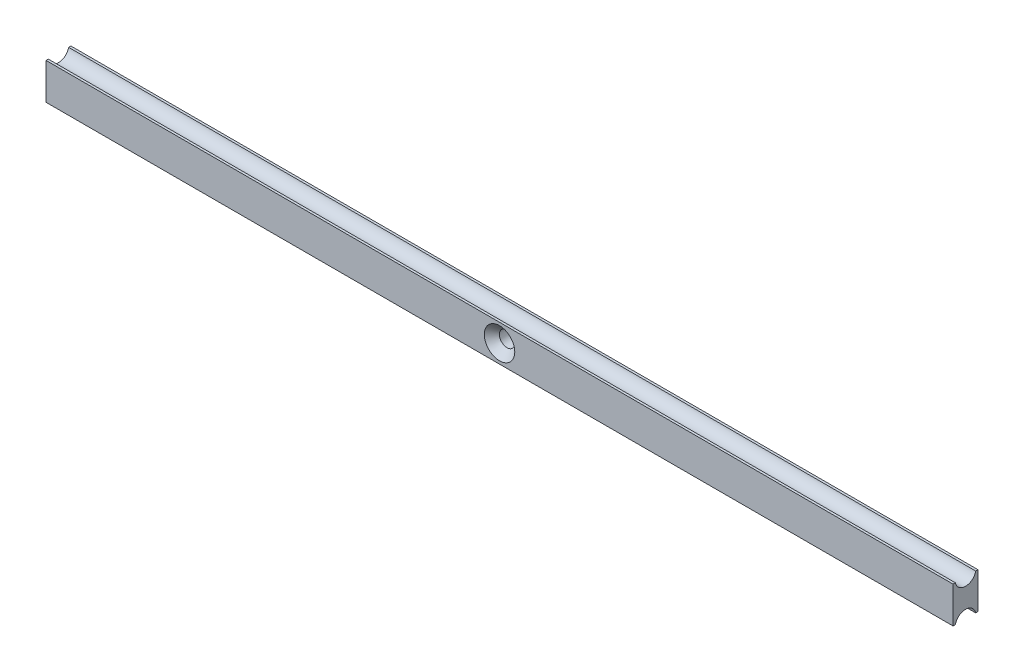
ISO-10303-21;
HEADER;
FILE_DESCRIPTION(('STEP AP214'),'2;1');
FILE_NAME('part.step','',(''),(''),'','','');
FILE_SCHEMA(('AUTOMOTIVE_DESIGN { 1 0 10303 214 1 1 1 1 }'));
ENDSEC;
DATA;
#1=APPLICATION_CONTEXT('core data for automotive mechanical design processes');
#2=APPLICATION_PROTOCOL_DEFINITION('international standard','automotive_design',2000,#1);
#3=PRODUCT_CONTEXT('',#1,'mechanical');
#4=PRODUCT('Part','Part','',(#3));
#5=PRODUCT_RELATED_PRODUCT_CATEGORY('part','',(#4));
#6=PRODUCT_DEFINITION_FORMATION('','',#4);
#7=PRODUCT_DEFINITION_CONTEXT('part definition',#1,'design');
#8=PRODUCT_DEFINITION('design','',#6,#7);
#9=PRODUCT_DEFINITION_SHAPE('','',#8);
#10=(LENGTH_UNIT() NAMED_UNIT(*) SI_UNIT(.MILLI.,.METRE.));
#11=(NAMED_UNIT(*) PLANE_ANGLE_UNIT() SI_UNIT($,.RADIAN.));
#12=(NAMED_UNIT(*) SI_UNIT($,.STERADIAN.) SOLID_ANGLE_UNIT());
#13=UNCERTAINTY_MEASURE_WITH_UNIT(LENGTH_MEASURE(1.E-05),#10,'distance_accuracy_value','');
#14=(GEOMETRIC_REPRESENTATION_CONTEXT(3) GLOBAL_UNCERTAINTY_ASSIGNED_CONTEXT((#13)) GLOBAL_UNIT_ASSIGNED_CONTEXT((#10,
#11,#12)) REPRESENTATION_CONTEXT('',''));
#15=CARTESIAN_POINT('',(0.,0.,0.));
#16=DIRECTION('',(0.,0.,1.));
#17=DIRECTION('',(1.,0.,0.));
#18=AXIS2_PLACEMENT_3D('',#15,#16,#17);
#19=CARTESIAN_POINT('',(-100.,4.,2.75));
#20=DIRECTION('',(0.,-1.,0.));
#21=DIRECTION('',(0.,0.,-1.));
#22=AXIS2_PLACEMENT_3D('',#19,#20,#21);
#23=PLANE('',#22);
#24=DIRECTION('',(0.,0.,-1.));
#25=VECTOR('',#24,1.);
#26=CARTESIAN_POINT('',(-100.,4.,2.75));
#27=LINE('',#26,#25);
#28=CARTESIAN_POINT('',(-100.,4.,-2.24499443206436));
#29=VERTEX_POINT('',#28);
#30=CARTESIAN_POINT('',(-100.,4.,-2.75));
#31=VERTEX_POINT('',#30);
#32=EDGE_CURVE('E144',#29,#31,#27,.T.);
#33=ORIENTED_EDGE('',*,*,#32,.F.);
#34=DIRECTION('',(1.,0.,0.));
#35=VECTOR('',#34,1.);
#36=CARTESIAN_POINT('',(-100.,4.,-2.24499443206436));
#37=LINE('',#36,#35);
#38=CARTESIAN_POINT('',(100.,4.,-2.24499443206436));
#39=VERTEX_POINT('',#38);
#40=EDGE_CURVE('E59',#29,#39,#37,.T.);
#41=ORIENTED_EDGE('',*,*,#40,.T.);
#42=DIRECTION('',(0.,0.,-1.));
#43=VECTOR('',#42,1.);
#44=CARTESIAN_POINT('',(100.,4.,2.75));
#45=LINE('',#44,#43);
#46=CARTESIAN_POINT('',(100.,4.,-2.75));
#47=VERTEX_POINT('',#46);
#48=EDGE_CURVE('E148',#39,#47,#45,.T.);
#49=ORIENTED_EDGE('',*,*,#48,.T.);
#50=DIRECTION('',(-1.,0.,0.));
#51=VECTOR('',#50,1.);
#52=CARTESIAN_POINT('',(-100.,4.,-2.75));
#53=LINE('',#52,#51);
#54=EDGE_CURVE('E157',#47,#31,#53,.T.);
#55=ORIENTED_EDGE('',*,*,#54,.T.);
#56=EDGE_LOOP('',(#33,#41,#49,#55));
#57=FACE_BOUND('',#56,.T.);
#58=ADVANCED_FACE('F43',(#57),#23,.F.);
#59=CARTESIAN_POINT('',(-100.,-4.,2.75));
#60=DIRECTION('',(0.,1.,0.));
#61=DIRECTION('',(0.,0.,1.));
#62=AXIS2_PLACEMENT_3D('',#59,#60,#61);
#63=PLANE('',#62);
#64=DIRECTION('',(0.,0.,-1.));
#65=VECTOR('',#64,1.);
#66=CARTESIAN_POINT('',(-100.,-4.,2.75));
#67=LINE('',#66,#65);
#68=CARTESIAN_POINT('',(-100.,-4.,2.75));
#69=VERTEX_POINT('',#68);
#70=CARTESIAN_POINT('',(-100.,-4.,2.24499443206437));
#71=VERTEX_POINT('',#70);
#72=EDGE_CURVE('E141',#69,#71,#67,.T.);
#73=ORIENTED_EDGE('',*,*,#72,.T.);
#74=DIRECTION('',(1.,0.,0.));
#75=VECTOR('',#74,1.);
#76=CARTESIAN_POINT('',(-100.,-4.,2.24499443206437));
#77=LINE('',#76,#75);
#78=CARTESIAN_POINT('',(100.,-4.,2.24499443206437));
#79=VERTEX_POINT('',#78);
#80=EDGE_CURVE('E11',#71,#79,#77,.T.);
#81=ORIENTED_EDGE('',*,*,#80,.T.);
#82=DIRECTION('',(0.,0.,-1.));
#83=VECTOR('',#82,1.);
#84=CARTESIAN_POINT('',(100.,-4.,2.75));
#85=LINE('',#84,#83);
#86=CARTESIAN_POINT('',(100.,-4.,2.75));
#87=VERTEX_POINT('',#86);
#88=EDGE_CURVE('E123',#87,#79,#85,.T.);
#89=ORIENTED_EDGE('',*,*,#88,.F.);
#90=DIRECTION('',(1.,0.,0.));
#91=VECTOR('',#90,1.);
#92=CARTESIAN_POINT('',(-100.,-4.,2.75));
#93=LINE('',#92,#91);
#94=EDGE_CURVE('E131',#69,#87,#93,.T.);
#95=ORIENTED_EDGE('',*,*,#94,.F.);
#96=EDGE_LOOP('',(#73,#81,#89,#95));
#97=FACE_BOUND('',#96,.T.);
#98=ADVANCED_FACE('F189',(#97),#63,.F.);
#99=CARTESIAN_POINT('',(100.,-4.,2.75));
#100=DIRECTION('',(-1.,0.,0.));
#101=DIRECTION('',(0.,0.,1.));
#102=AXIS2_PLACEMENT_3D('',#99,#100,#101);
#103=PLANE('',#102);
#104=ORIENTED_EDGE('',*,*,#48,.F.);
#105=CARTESIAN_POINT('',(100.,4.5,0.));
#106=DIRECTION('',(1.,0.,0.));
#107=DIRECTION('',(0.,0.,-1.));
#108=AXIS2_PLACEMENT_3D('',#105,#106,#107);
#109=CIRCLE('',#108,2.3);
#110=CARTESIAN_POINT('',(100.,4.,2.24499443206436));
#111=VERTEX_POINT('',#110);
#112=EDGE_CURVE('E124',#111,#39,#109,.T.);
#113=ORIENTED_EDGE('',*,*,#112,.F.);
#114=CARTESIAN_POINT('',(100.,4.,2.75));
#115=VERTEX_POINT('',#114);
#116=EDGE_CURVE('E114',#115,#111,#45,.T.);
#117=ORIENTED_EDGE('',*,*,#116,.F.);
#118=DIRECTION('',(0.,1.,0.));
#119=VECTOR('',#118,1.);
#120=CARTESIAN_POINT('',(100.,-4.,2.75));
#121=LINE('',#120,#119);
#122=EDGE_CURVE('E174',#87,#115,#121,.T.);
#123=ORIENTED_EDGE('',*,*,#122,.F.);
#124=ORIENTED_EDGE('',*,*,#88,.T.);
#125=CARTESIAN_POINT('',(100.,-4.5,0.));
#126=DIRECTION('',(1.,0.,0.));
#127=DIRECTION('',(0.,0.,-1.));
#128=AXIS2_PLACEMENT_3D('',#125,#126,#127);
#129=CIRCLE('',#128,2.3);
#130=CARTESIAN_POINT('',(100.,-4.,-2.24499443206437));
#131=VERTEX_POINT('',#130);
#132=EDGE_CURVE('E109',#131,#79,#129,.T.);
#133=ORIENTED_EDGE('',*,*,#132,.F.);
#134=CARTESIAN_POINT('',(100.,-4.,-2.75));
#135=VERTEX_POINT('',#134);
#136=EDGE_CURVE('E119',#131,#135,#85,.T.);
#137=ORIENTED_EDGE('',*,*,#136,.T.);
#138=DIRECTION('',(0.,1.,0.));
#139=VECTOR('',#138,1.);
#140=CARTESIAN_POINT('',(100.,-4.,-2.75));
#141=LINE('',#140,#139);
#142=EDGE_CURVE('E162',#135,#47,#141,.T.);
#143=ORIENTED_EDGE('',*,*,#142,.T.);
#144=EDGE_LOOP('',(#104,#113,#117,#123,#124,#133,#137,#143));
#145=FACE_BOUND('',#144,.T.);
#146=ADVANCED_FACE('F45',(#145),#103,.F.);
#147=ORIENTED_EDGE('',*,*,#116,.T.);
#148=DIRECTION('',(1.,0.,0.));
#149=VECTOR('',#148,1.);
#150=CARTESIAN_POINT('',(-100.,4.,2.24499443206436));
#151=LINE('',#150,#149);
#152=CARTESIAN_POINT('',(-100.,4.,2.24499443206436));
#153=VERTEX_POINT('',#152);
#154=EDGE_CURVE('E170',#111,#153,#151,.F.);
#155=ORIENTED_EDGE('',*,*,#154,.T.);
#156=CARTESIAN_POINT('',(-100.,4.,2.75));
#157=VERTEX_POINT('',#156);
#158=EDGE_CURVE('E145',#157,#153,#27,.T.);
#159=ORIENTED_EDGE('',*,*,#158,.F.);
#160=DIRECTION('',(-1.,0.,0.));
#161=VECTOR('',#160,1.);
#162=CARTESIAN_POINT('',(-100.,4.,2.75));
#163=LINE('',#162,#161);
#164=EDGE_CURVE('E176',#115,#157,#163,.T.);
#165=ORIENTED_EDGE('',*,*,#164,.F.);
#166=EDGE_LOOP('',(#147,#155,#159,#165));
#167=FACE_BOUND('',#166,.T.);
#168=ADVANCED_FACE('F198',(#167),#23,.F.);
#169=CARTESIAN_POINT('',(-100.,-4.,2.75));
#170=DIRECTION('',(1.,0.,0.));
#171=DIRECTION('',(0.,0.,-1.));
#172=AXIS2_PLACEMENT_3D('',#169,#170,#171);
#173=PLANE('',#172);
#174=ORIENTED_EDGE('',*,*,#158,.T.);
#175=CARTESIAN_POINT('',(-100.,4.5,0.));
#176=DIRECTION('',(1.,0.,0.));
#177=DIRECTION('',(0.,0.,-1.));
#178=AXIS2_PLACEMENT_3D('',#175,#176,#177);
#179=CIRCLE('',#178,2.3);
#180=EDGE_CURVE('E190',#153,#29,#179,.T.);
#181=ORIENTED_EDGE('',*,*,#180,.T.);
#182=ORIENTED_EDGE('',*,*,#32,.T.);
#183=DIRECTION('',(0.,-1.,0.));
#184=VECTOR('',#183,1.);
#185=CARTESIAN_POINT('',(-100.,-4.,-2.75));
#186=LINE('',#185,#184);
#187=CARTESIAN_POINT('',(-100.,-4.,-2.75));
#188=VERTEX_POINT('',#187);
#189=EDGE_CURVE('E164',#31,#188,#186,.T.);
#190=ORIENTED_EDGE('',*,*,#189,.T.);
#191=CARTESIAN_POINT('',(-100.,-4.,-2.24499443206437));
#192=VERTEX_POINT('',#191);
#193=EDGE_CURVE('E135',#192,#188,#67,.T.);
#194=ORIENTED_EDGE('',*,*,#193,.F.);
#195=CARTESIAN_POINT('',(-100.,-4.5,0.));
#196=DIRECTION('',(1.,0.,0.));
#197=DIRECTION('',(0.,0.,-1.));
#198=AXIS2_PLACEMENT_3D('',#195,#196,#197);
#199=CIRCLE('',#198,2.3);
#200=EDGE_CURVE('E67',#192,#71,#199,.T.);
#201=ORIENTED_EDGE('',*,*,#200,.T.);
#202=ORIENTED_EDGE('',*,*,#72,.F.);
#203=DIRECTION('',(0.,-1.,0.));
#204=VECTOR('',#203,1.);
#205=CARTESIAN_POINT('',(-100.,-4.,2.75));
#206=LINE('',#205,#204);
#207=EDGE_CURVE('E136',#157,#69,#206,.T.);
#208=ORIENTED_EDGE('',*,*,#207,.F.);
#209=EDGE_LOOP('',(#174,#181,#182,#190,#194,#201,#202,#208));
#210=FACE_BOUND('',#209,.T.);
#211=ADVANCED_FACE('F187',(#210),#173,.F.);
#212=ORIENTED_EDGE('',*,*,#136,.F.);
#213=DIRECTION('',(1.,0.,0.));
#214=VECTOR('',#213,1.);
#215=CARTESIAN_POINT('',(-100.,-4.,-2.24499443206437));
#216=LINE('',#215,#214);
#217=EDGE_CURVE('E52',#131,#192,#216,.F.);
#218=ORIENTED_EDGE('',*,*,#217,.T.);
#219=ORIENTED_EDGE('',*,*,#193,.T.);
#220=DIRECTION('',(1.,0.,0.));
#221=VECTOR('',#220,1.);
#222=CARTESIAN_POINT('',(-100.,-4.,-2.75));
#223=LINE('',#222,#221);
#224=EDGE_CURVE('E128',#188,#135,#223,.T.);
#225=ORIENTED_EDGE('',*,*,#224,.T.);
#226=EDGE_LOOP('',(#212,#218,#219,#225));
#227=FACE_BOUND('',#226,.T.);
#228=ADVANCED_FACE('F126',(#227),#63,.F.);
#229=CARTESIAN_POINT('',(0.,0.,2.75));
#230=DIRECTION('',(0.,0.,-1.));
#231=DIRECTION('',(-1.,0.,0.));
#232=AXIS2_PLACEMENT_3D('',#229,#230,#231);
#233=PLANE('',#232);
#234=CARTESIAN_POINT('',(0.,0.,2.75));
#235=DIRECTION('',(0.,0.,1.));
#236=DIRECTION('',(1.,0.,0.));
#237=AXIS2_PLACEMENT_3D('',#234,#235,#236);
#238=CIRCLE('',#237,3.36);
#239=CARTESIAN_POINT('',(3.36,0.,2.75));
#240=VERTEX_POINT('',#239);
#241=EDGE_CURVE('E345',#240,#240,#238,.T.);
#242=ORIENTED_EDGE('',*,*,#241,.F.);
#243=EDGE_LOOP('',(#242));
#244=FACE_BOUND('',#243,.T.);
#245=ORIENTED_EDGE('',*,*,#122,.T.);
#246=ORIENTED_EDGE('',*,*,#164,.T.);
#247=ORIENTED_EDGE('',*,*,#207,.T.);
#248=ORIENTED_EDGE('',*,*,#94,.T.);
#249=EDGE_LOOP('',(#245,#246,#247,#248));
#250=FACE_BOUND('',#249,.T.);
#251=ADVANCED_FACE('F184',(#244,#250),#233,.F.);
#252=CARTESIAN_POINT('',(0.,0.,-2.75));
#253=DIRECTION('',(0.,0.,-1.));
#254=DIRECTION('',(-1.,0.,0.));
#255=AXIS2_PLACEMENT_3D('',#252,#253,#254);
#256=PLANE('',#255);
#257=CARTESIAN_POINT('',(0.,0.,-2.75));
#258=DIRECTION('',(0.,0.,1.));
#259=DIRECTION('',(1.,0.,0.));
#260=AXIS2_PLACEMENT_3D('',#257,#258,#259);
#261=CIRCLE('',#260,2.);
#262=CARTESIAN_POINT('',(2.,0.,-2.75));
#263=VERTEX_POINT('',#262);
#264=EDGE_CURVE('E347',#263,#263,#261,.T.);
#265=ORIENTED_EDGE('',*,*,#264,.T.);
#266=EDGE_LOOP('',(#265));
#267=FACE_BOUND('',#266,.T.);
#268=ORIENTED_EDGE('',*,*,#142,.F.);
#269=ORIENTED_EDGE('',*,*,#224,.F.);
#270=ORIENTED_EDGE('',*,*,#189,.F.);
#271=ORIENTED_EDGE('',*,*,#54,.F.);
#272=EDGE_LOOP('',(#268,#269,#270,#271));
#273=FACE_BOUND('',#272,.T.);
#274=ADVANCED_FACE('F161',(#267,#273),#256,.T.);
#275=CARTESIAN_POINT('',(-100.,-4.5,0.));
#276=DIRECTION('',(1.,0.,0.));
#277=DIRECTION('',(0.,0.,-1.));
#278=AXIS2_PLACEMENT_3D('',#275,#276,#277);
#279=CYLINDRICAL_SURFACE('',#278,2.3);
#280=ORIENTED_EDGE('',*,*,#200,.F.);
#281=ORIENTED_EDGE('',*,*,#217,.F.);
#282=ORIENTED_EDGE('',*,*,#132,.T.);
#283=ORIENTED_EDGE('',*,*,#80,.F.);
#284=EDGE_LOOP('',(#280,#281,#282,#283));
#285=FACE_BOUND('',#284,.T.);
#286=ADVANCED_FACE('F108',(#285),#279,.F.);
#287=CARTESIAN_POINT('',(-100.,4.5,0.));
#288=DIRECTION('',(1.,0.,0.));
#289=DIRECTION('',(0.,0.,-1.));
#290=AXIS2_PLACEMENT_3D('',#287,#288,#289);
#291=CYLINDRICAL_SURFACE('',#290,2.3);
#292=ORIENTED_EDGE('',*,*,#180,.F.);
#293=ORIENTED_EDGE('',*,*,#154,.F.);
#294=ORIENTED_EDGE('',*,*,#112,.T.);
#295=ORIENTED_EDGE('',*,*,#40,.F.);
#296=EDGE_LOOP('',(#292,#293,#294,#295));
#297=FACE_BOUND('',#296,.T.);
#298=ADVANCED_FACE('F199',(#297),#291,.F.);
#299=CARTESIAN_POINT('',(0.,0.,-2.45));
#300=DIRECTION('',(0.,0.,-1.));
#301=DIRECTION('',(-1.,0.,0.));
#302=AXIS2_PLACEMENT_3D('',#299,#300,#301);
#303=CONICAL_SURFACE('',#302,1.7,0.785398163397447);
#304=ORIENTED_EDGE('',*,*,#264,.F.);
#305=EDGE_LOOP('',(#304));
#306=FACE_BOUND('',#305,.T.);
#307=CARTESIAN_POINT('',(0.,0.,-2.45));
#308=DIRECTION('',(0.,0.,1.));
#309=DIRECTION('',(1.,0.,0.));
#310=AXIS2_PLACEMENT_3D('',#307,#308,#309);
#311=CIRCLE('',#310,1.7);
#312=CARTESIAN_POINT('',(1.7,0.,-2.45));
#313=VERTEX_POINT('',#312);
#314=EDGE_CURVE('E194',#313,#313,#311,.T.);
#315=ORIENTED_EDGE('',*,*,#314,.T.);
#316=EDGE_LOOP('',(#315));
#317=FACE_BOUND('',#316,.T.);
#318=ADVANCED_FACE('F201',(#306,#317),#303,.F.);
#319=CARTESIAN_POINT('',(0.,0.,2.75));
#320=DIRECTION('',(0.,0.,1.));
#321=DIRECTION('',(1.,0.,0.));
#322=AXIS2_PLACEMENT_3D('',#319,#320,#321);
#323=CYLINDRICAL_SURFACE('',#322,1.7);
#324=ORIENTED_EDGE('',*,*,#314,.F.);
#325=EDGE_LOOP('',(#324));
#326=FACE_BOUND('',#325,.T.);
#327=CARTESIAN_POINT('',(0.,0.,1.09));
#328=DIRECTION('',(0.,0.,1.));
#329=DIRECTION('',(1.,0.,0.));
#330=AXIS2_PLACEMENT_3D('',#327,#328,#329);
#331=CIRCLE('',#330,1.7);
#332=CARTESIAN_POINT('',(1.7,0.,1.09));
#333=VERTEX_POINT('',#332);
#334=EDGE_CURVE('E342',#333,#333,#331,.T.);
#335=ORIENTED_EDGE('',*,*,#334,.T.);
#336=EDGE_LOOP('',(#335));
#337=FACE_BOUND('',#336,.T.);
#338=ADVANCED_FACE('F207',(#326,#337),#323,.F.);
#339=CARTESIAN_POINT('',(0.,0.,2.75));
#340=DIRECTION('',(0.,0.,1.));
#341=DIRECTION('',(1.,0.,0.));
#342=AXIS2_PLACEMENT_3D('',#339,#340,#341);
#343=CONICAL_SURFACE('',#342,3.36,0.785398163397448);
#344=ORIENTED_EDGE('',*,*,#334,.F.);
#345=EDGE_LOOP('',(#344));
#346=FACE_BOUND('',#345,.T.);
#347=ORIENTED_EDGE('',*,*,#241,.T.);
#348=EDGE_LOOP('',(#347));
#349=FACE_BOUND('',#348,.T.);
#350=ADVANCED_FACE('F322',(#346,#349),#343,.F.);
#351=CLOSED_SHELL('',(#58,#98,#146,#168,#211,#228,#251,#274,#286,#298,#318,#338,#350));
#352=MANIFOLD_SOLID_BREP('B2',#351);
#353=ADVANCED_BREP_SHAPE_REPRESENTATION('',(#18,#352),#14);
#354=SHAPE_DEFINITION_REPRESENTATION(#9,#353);
ENDSEC;
END-ISO-10303-21;
